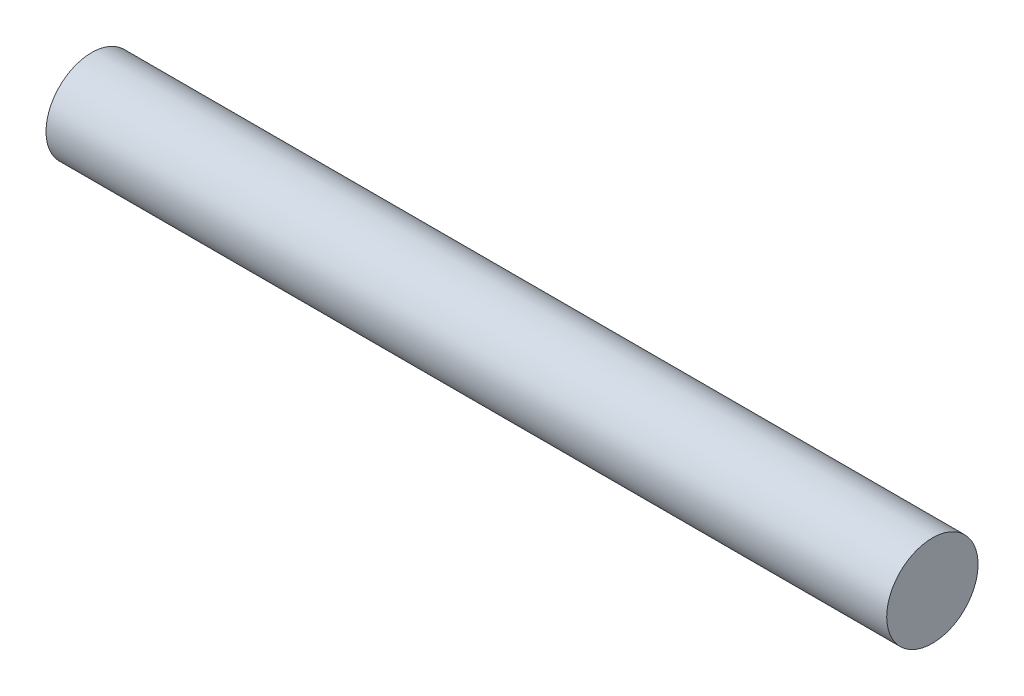
ISO-10303-21;
HEADER;
FILE_DESCRIPTION(('STEP AP214'),'2;1');
FILE_NAME('part.step','',(''),(''),'','','');
FILE_SCHEMA(('AUTOMOTIVE_DESIGN { 1 0 10303 214 1 1 1 1 }'));
ENDSEC;
DATA;
#1=APPLICATION_CONTEXT('core data for automotive mechanical design processes');
#2=APPLICATION_PROTOCOL_DEFINITION('international standard','automotive_design',2000,#1);
#3=PRODUCT_CONTEXT('',#1,'mechanical');
#4=PRODUCT('Part','Part','',(#3));
#5=PRODUCT_RELATED_PRODUCT_CATEGORY('part','',(#4));
#6=PRODUCT_DEFINITION_FORMATION('','',#4);
#7=PRODUCT_DEFINITION_CONTEXT('part definition',#1,'design');
#8=PRODUCT_DEFINITION('design','',#6,#7);
#9=PRODUCT_DEFINITION_SHAPE('','',#8);
#10=(LENGTH_UNIT() NAMED_UNIT(*) SI_UNIT(.MILLI.,.METRE.));
#11=(NAMED_UNIT(*) PLANE_ANGLE_UNIT() SI_UNIT($,.RADIAN.));
#12=(NAMED_UNIT(*) SI_UNIT($,.STERADIAN.) SOLID_ANGLE_UNIT());
#13=UNCERTAINTY_MEASURE_WITH_UNIT(LENGTH_MEASURE(1.E-05),#10,'distance_accuracy_value','');
#14=(GEOMETRIC_REPRESENTATION_CONTEXT(3) GLOBAL_UNCERTAINTY_ASSIGNED_CONTEXT((#13)) GLOBAL_UNIT_ASSIGNED_CONTEXT((#10,
#11,#12)) REPRESENTATION_CONTEXT('',''));
#15=CARTESIAN_POINT('',(0.,0.,0.));
#16=DIRECTION('',(0.,0.,1.));
#17=DIRECTION('',(1.,0.,0.));
#18=AXIS2_PLACEMENT_3D('',#15,#16,#17);
#19=CARTESIAN_POINT('',(0.,0.,0.));
#20=DIRECTION('',(1.,0.,0.));
#21=DIRECTION('',(0.,0.,-1.));
#22=AXIS2_PLACEMENT_3D('',#19,#20,#21);
#23=PLANE('',#22);
#24=CARTESIAN_POINT('',(0.,0.,0.));
#25=DIRECTION('',(-1.,0.,0.));
#26=DIRECTION('',(0.,0.,1.));
#27=AXIS2_PLACEMENT_3D('',#24,#25,#26);
#28=CIRCLE('',#27,10.);
#29=CARTESIAN_POINT('',(0.,0.,10.));
#30=VERTEX_POINT('',#29);
#31=EDGE_CURVE('E10',#30,#30,#28,.T.);
#32=ORIENTED_EDGE('',*,*,#31,.T.);
#33=EDGE_LOOP('',(#32));
#34=FACE_BOUND('',#33,.T.);
#35=ADVANCED_FACE('F32',(#34),#23,.F.);
#36=CARTESIAN_POINT('',(-1000.,0.,0.));
#37=DIRECTION('',(-1.,0.,0.));
#38=DIRECTION('',(0.,0.,1.));
#39=AXIS2_PLACEMENT_3D('',#36,#37,#38);
#40=CYLINDRICAL_SURFACE('',#39,10.);
#41=ORIENTED_EDGE('',*,*,#31,.F.);
#42=EDGE_LOOP('',(#41));
#43=FACE_BOUND('',#42,.T.);
#44=CARTESIAN_POINT('',(184.,0.,0.));
#45=DIRECTION('',(-1.,0.,0.));
#46=DIRECTION('',(0.,0.,1.));
#47=AXIS2_PLACEMENT_3D('',#44,#45,#46);
#48=CIRCLE('',#47,10.);
#49=CARTESIAN_POINT('',(184.,0.,10.));
#50=VERTEX_POINT('',#49);
#51=EDGE_CURVE('E38',#50,#50,#48,.T.);
#52=ORIENTED_EDGE('',*,*,#51,.T.);
#53=EDGE_LOOP('',(#52));
#54=FACE_BOUND('',#53,.T.);
#55=ADVANCED_FACE('F44',(#43,#54),#40,.T.);
#56=CARTESIAN_POINT('',(184.,0.,-10.));
#57=DIRECTION('',(-1.,0.,0.));
#58=DIRECTION('',(0.,0.,1.));
#59=AXIS2_PLACEMENT_3D('',#56,#57,#58);
#60=PLANE('',#59);
#61=ORIENTED_EDGE('',*,*,#51,.F.);
#62=EDGE_LOOP('',(#61));
#63=FACE_BOUND('',#62,.T.);
#64=ADVANCED_FACE('F46',(#63),#60,.F.);
#65=CLOSED_SHELL('',(#35,#55,#64));
#66=MANIFOLD_SOLID_BREP('B2',#65);
#67=ADVANCED_BREP_SHAPE_REPRESENTATION('',(#18,#66),#14);
#68=SHAPE_DEFINITION_REPRESENTATION(#9,#67);
ENDSEC;
END-ISO-10303-21;
